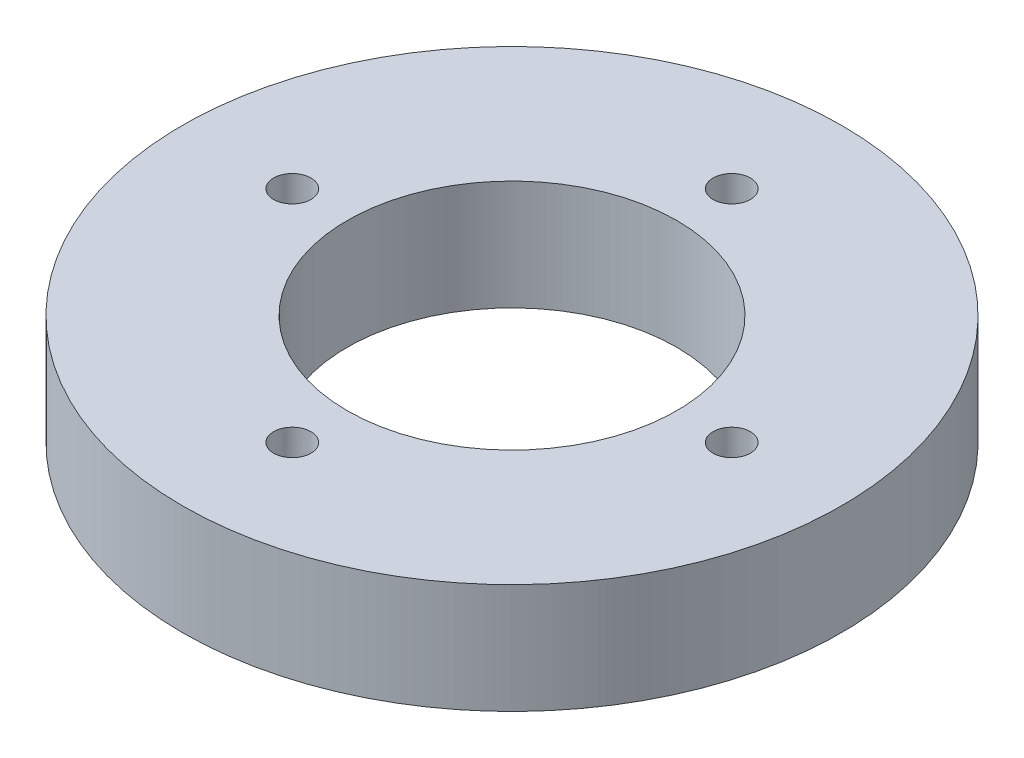
ISO-10303-21;
HEADER;
FILE_DESCRIPTION(('STEP AP214'),'2;1');
FILE_NAME('part.step','',(''),(''),'','','');
FILE_SCHEMA(('AUTOMOTIVE_DESIGN { 1 0 10303 214 1 1 1 1 }'));
ENDSEC;
DATA;
#1=APPLICATION_CONTEXT('core data for automotive mechanical design processes');
#2=APPLICATION_PROTOCOL_DEFINITION('international standard','automotive_design',2000,#1);
#3=PRODUCT_CONTEXT('',#1,'mechanical');
#4=PRODUCT('Part','Part','',(#3));
#5=PRODUCT_RELATED_PRODUCT_CATEGORY('part','',(#4));
#6=PRODUCT_DEFINITION_FORMATION('','',#4);
#7=PRODUCT_DEFINITION_CONTEXT('part definition',#1,'design');
#8=PRODUCT_DEFINITION('design','',#6,#7);
#9=PRODUCT_DEFINITION_SHAPE('','',#8);
#10=(LENGTH_UNIT() NAMED_UNIT(*) SI_UNIT(.MILLI.,.METRE.));
#11=(NAMED_UNIT(*) PLANE_ANGLE_UNIT() SI_UNIT($,.RADIAN.));
#12=(NAMED_UNIT(*) SI_UNIT($,.STERADIAN.) SOLID_ANGLE_UNIT());
#13=UNCERTAINTY_MEASURE_WITH_UNIT(LENGTH_MEASURE(1.E-05),#10,'distance_accuracy_value','');
#14=(GEOMETRIC_REPRESENTATION_CONTEXT(3) GLOBAL_UNCERTAINTY_ASSIGNED_CONTEXT((#13)) GLOBAL_UNIT_ASSIGNED_CONTEXT((#10,
#11,#12)) REPRESENTATION_CONTEXT('',''));
#15=CARTESIAN_POINT('',(0.,0.,0.));
#16=DIRECTION('',(0.,0.,1.));
#17=DIRECTION('',(1.,0.,0.));
#18=AXIS2_PLACEMENT_3D('',#15,#16,#17);
#19=CARTESIAN_POINT('',(20.,0.,2.09488880330588E-13));
#20=DIRECTION('',(0.,1.,0.));
#21=DIRECTION('',(0.,0.,1.));
#22=AXIS2_PLACEMENT_3D('',#19,#20,#21);
#23=CYLINDRICAL_SURFACE('',#22,1.7);
#24=CARTESIAN_POINT('',(20.,10.,2.09488880330588E-13));
#25=DIRECTION('',(0.,1.,0.));
#26=DIRECTION('',(1.,0.,0.));
#27=AXIS2_PLACEMENT_3D('',#24,#25,#26);
#28=CIRCLE('',#27,1.7);
#29=CARTESIAN_POINT('',(21.7,10.,2.27295435158688E-13));
#30=VERTEX_POINT('',#29);
#31=EDGE_CURVE('E422',#30,#30,#28,.T.);
#32=ORIENTED_EDGE('',*,*,#31,.T.);
#33=EDGE_LOOP('',(#32));
#34=FACE_BOUND('',#33,.T.);
#35=CARTESIAN_POINT('',(20.,3.,2.09488880330588E-13));
#36=DIRECTION('',(0.,-1.,0.));
#37=DIRECTION('',(0.,0.,-1.));
#38=AXIS2_PLACEMENT_3D('',#35,#36,#37);
#39=CIRCLE('',#38,1.7);
#40=CARTESIAN_POINT('',(20.,3.,-1.69999999999979));
#41=VERTEX_POINT('',#40);
#42=EDGE_CURVE('E49',#41,#41,#39,.F.);
#43=ORIENTED_EDGE('',*,*,#42,.F.);
#44=EDGE_LOOP('',(#43));
#45=FACE_BOUND('',#44,.T.);
#46=ADVANCED_FACE('F45',(#34,#45),#23,.F.);
#47=CARTESIAN_POINT('',(0.,0.,-20.));
#48=DIRECTION('',(0.,1.,0.));
#49=DIRECTION('',(0.,0.,1.));
#50=AXIS2_PLACEMENT_3D('',#47,#48,#49);
#51=CYLINDRICAL_SURFACE('',#50,1.7);
#52=CARTESIAN_POINT('',(0.,10.,-20.));
#53=DIRECTION('',(0.,1.,0.));
#54=DIRECTION('',(0.,0.,-1.));
#55=AXIS2_PLACEMENT_3D('',#52,#53,#54);
#56=CIRCLE('',#55,1.7);
#57=CARTESIAN_POINT('',(0.,10.,-21.7));
#58=VERTEX_POINT('',#57);
#59=EDGE_CURVE('E418',#58,#58,#56,.T.);
#60=ORIENTED_EDGE('',*,*,#59,.T.);
#61=EDGE_LOOP('',(#60));
#62=FACE_BOUND('',#61,.T.);
#63=CARTESIAN_POINT('',(0.,3.,-20.));
#64=DIRECTION('',(0.,-1.,0.));
#65=DIRECTION('',(0.,0.,-1.));
#66=AXIS2_PLACEMENT_3D('',#63,#64,#65);
#67=CIRCLE('',#66,1.7);
#68=CARTESIAN_POINT('',(0.,3.,-21.7));
#69=VERTEX_POINT('',#68);
#70=EDGE_CURVE('E512',#69,#69,#67,.F.);
#71=ORIENTED_EDGE('',*,*,#70,.F.);
#72=EDGE_LOOP('',(#71));
#73=FACE_BOUND('',#72,.T.);
#74=ADVANCED_FACE('F524',(#62,#73),#51,.F.);
#75=CARTESIAN_POINT('',(-20.,0.,0.));
#76=DIRECTION('',(0.,1.,0.));
#77=DIRECTION('',(0.,0.,1.));
#78=AXIS2_PLACEMENT_3D('',#75,#76,#77);
#79=CYLINDRICAL_SURFACE('',#78,1.7);
#80=CARTESIAN_POINT('',(-20.,10.,0.));
#81=DIRECTION('',(0.,1.,0.));
#82=DIRECTION('',(-1.,0.,0.));
#83=AXIS2_PLACEMENT_3D('',#80,#81,#82);
#84=CIRCLE('',#83,1.7);
#85=CARTESIAN_POINT('',(-21.7,10.,0.));
#86=VERTEX_POINT('',#85);
#87=EDGE_CURVE('E413',#86,#86,#84,.T.);
#88=ORIENTED_EDGE('',*,*,#87,.T.);
#89=EDGE_LOOP('',(#88));
#90=FACE_BOUND('',#89,.T.);
#91=CARTESIAN_POINT('',(-20.,3.,0.));
#92=DIRECTION('',(0.,-1.,0.));
#93=DIRECTION('',(0.,0.,-1.));
#94=AXIS2_PLACEMENT_3D('',#91,#92,#93);
#95=CIRCLE('',#94,1.7);
#96=CARTESIAN_POINT('',(-20.,3.,-1.70000000000007));
#97=VERTEX_POINT('',#96);
#98=EDGE_CURVE('E272',#97,#97,#95,.F.);
#99=ORIENTED_EDGE('',*,*,#98,.F.);
#100=EDGE_LOOP('',(#99));
#101=FACE_BOUND('',#100,.T.);
#102=ADVANCED_FACE('F531',(#90,#101),#79,.F.);
#103=CARTESIAN_POINT('',(0.,0.,20.));
#104=DIRECTION('',(0.,1.,0.));
#105=DIRECTION('',(0.,0.,1.));
#106=AXIS2_PLACEMENT_3D('',#103,#104,#105);
#107=CYLINDRICAL_SURFACE('',#106,1.7);
#108=CARTESIAN_POINT('',(0.,10.,20.));
#109=DIRECTION('',(0.,1.,0.));
#110=DIRECTION('',(0.,0.,1.));
#111=AXIS2_PLACEMENT_3D('',#108,#109,#110);
#112=CIRCLE('',#111,1.7);
#113=CARTESIAN_POINT('',(0.,10.,21.7));
#114=VERTEX_POINT('',#113);
#115=EDGE_CURVE('E492',#114,#114,#112,.T.);
#116=ORIENTED_EDGE('',*,*,#115,.T.);
#117=EDGE_LOOP('',(#116));
#118=FACE_BOUND('',#117,.T.);
#119=CARTESIAN_POINT('',(0.,3.,20.));
#120=DIRECTION('',(0.,-1.,0.));
#121=DIRECTION('',(0.,0.,-1.));
#122=AXIS2_PLACEMENT_3D('',#119,#120,#121);
#123=CIRCLE('',#122,1.7);
#124=CARTESIAN_POINT('',(0.,3.,18.3));
#125=VERTEX_POINT('',#124);
#126=EDGE_CURVE('E476',#125,#125,#123,.F.);
#127=ORIENTED_EDGE('',*,*,#126,.F.);
#128=EDGE_LOOP('',(#127));
#129=FACE_BOUND('',#128,.T.);
#130=ADVANCED_FACE('F564',(#118,#129),#107,.F.);
#131=CARTESIAN_POINT('',(0.,10.,0.));
#132=DIRECTION('',(0.,1.,0.));
#133=DIRECTION('',(0.,0.,1.));
#134=AXIS2_PLACEMENT_3D('',#131,#132,#133);
#135=PLANE('',#134);
#136=ORIENTED_EDGE('',*,*,#87,.F.);
#137=EDGE_LOOP('',(#136));
#138=FACE_BOUND('',#137,.T.);
#139=ORIENTED_EDGE('',*,*,#59,.F.);
#140=EDGE_LOOP('',(#139));
#141=FACE_BOUND('',#140,.T.);
#142=ORIENTED_EDGE('',*,*,#31,.F.);
#143=EDGE_LOOP('',(#142));
#144=FACE_BOUND('',#143,.T.);
#145=ORIENTED_EDGE('',*,*,#115,.F.);
#146=EDGE_LOOP('',(#145));
#147=FACE_BOUND('',#146,.T.);
#148=CARTESIAN_POINT('',(0.,10.,0.));
#149=DIRECTION('',(0.,1.,0.));
#150=DIRECTION('',(0.,0.,1.));
#151=AXIS2_PLACEMENT_3D('',#148,#149,#150);
#152=CIRCLE('',#151,30.);
#153=CARTESIAN_POINT('',(0.,10.,30.));
#154=VERTEX_POINT('',#153);
#155=EDGE_CURVE('E11',#154,#154,#152,.T.);
#156=ORIENTED_EDGE('',*,*,#155,.T.);
#157=EDGE_LOOP('',(#156));
#158=FACE_BOUND('',#157,.T.);
#159=CARTESIAN_POINT('',(0.,10.,0.));
#160=DIRECTION('',(0.,1.,0.));
#161=DIRECTION('',(0.,0.,1.));
#162=AXIS2_PLACEMENT_3D('',#159,#160,#161);
#163=CIRCLE('',#162,15.);
#164=CARTESIAN_POINT('',(0.,10.,15.));
#165=VERTEX_POINT('',#164);
#166=EDGE_CURVE('E497',#165,#165,#163,.T.);
#167=ORIENTED_EDGE('',*,*,#166,.F.);
#168=EDGE_LOOP('',(#167));
#169=FACE_BOUND('',#168,.T.);
#170=ADVANCED_FACE('F567',(#138,#141,#144,#147,#158,#169),#135,.T.);
#171=CARTESIAN_POINT('',(0.,0.,0.));
#172=DIRECTION('',(0.,1.,0.));
#173=DIRECTION('',(0.,0.,1.));
#174=AXIS2_PLACEMENT_3D('',#171,#172,#173);
#175=PLANE('',#174);
#176=DIRECTION('',(-0.866025403784437,0.,-0.500000000000003));
#177=VECTOR('',#176,1.);
#178=CARTESIAN_POINT('',(-20.,0.,3.46410161513768));
#179=LINE('',#178,#177);
#180=CARTESIAN_POINT('',(-20.,0.,3.46410161513769));
#181=VERTEX_POINT('',#180);
#182=CARTESIAN_POINT('',(-23.,0.,1.7320508075688));
#183=VERTEX_POINT('',#182);
#184=EDGE_CURVE('E254',#181,#183,#179,.T.);
#185=ORIENTED_EDGE('',*,*,#184,.F.);
#186=DIRECTION('',(-0.866025403784441,0.,0.499999999999997));
#187=VECTOR('',#186,1.);
#188=CARTESIAN_POINT('',(-17.,0.,1.73205080756882));
#189=LINE('',#188,#187);
#190=CARTESIAN_POINT('',(-17.,0.,1.73205080756882));
#191=VERTEX_POINT('',#190);
#192=EDGE_CURVE('E63',#191,#181,#189,.T.);
#193=ORIENTED_EDGE('',*,*,#192,.F.);
#194=DIRECTION('',(0.,0.,1.));
#195=VECTOR('',#194,1.);
#196=CARTESIAN_POINT('',(-17.,0.,-1.73205080756893));
#197=LINE('',#196,#195);
#198=CARTESIAN_POINT('',(-17.,0.,-1.73205080756893));
#199=VERTEX_POINT('',#198);
#200=EDGE_CURVE('E234',#199,#191,#197,.T.);
#201=ORIENTED_EDGE('',*,*,#200,.F.);
#202=DIRECTION('',(0.866025403784437,0.,0.500000000000003));
#203=VECTOR('',#202,1.);
#204=CARTESIAN_POINT('',(-20.,0.,-3.46410161513782));
#205=LINE('',#204,#203);
#206=CARTESIAN_POINT('',(-20.,0.,-3.46410161513782));
#207=VERTEX_POINT('',#206);
#208=EDGE_CURVE('E238',#207,#199,#205,.T.);
#209=ORIENTED_EDGE('',*,*,#208,.F.);
#210=DIRECTION('',(0.86602540378444,0.,-0.499999999999997));
#211=VECTOR('',#210,1.);
#212=CARTESIAN_POINT('',(-23.,0.,-1.73205080756896));
#213=LINE('',#212,#211);
#214=CARTESIAN_POINT('',(-23.,0.,-1.73205080756896));
#215=VERTEX_POINT('',#214);
#216=EDGE_CURVE('E262',#215,#207,#213,.T.);
#217=ORIENTED_EDGE('',*,*,#216,.F.);
#218=DIRECTION('',(0.,0.,-1.));
#219=VECTOR('',#218,1.);
#220=CARTESIAN_POINT('',(-23.,0.,1.7320508075688));
#221=LINE('',#220,#219);
#222=EDGE_CURVE('E258',#183,#215,#221,.T.);
#223=ORIENTED_EDGE('',*,*,#222,.F.);
#224=EDGE_LOOP('',(#185,#193,#201,#209,#217,#223));
#225=FACE_BOUND('',#224,.T.);
#226=DIRECTION('',(0.5,0.,-0.866025403784439));
#227=VECTOR('',#226,1.);
#228=CARTESIAN_POINT('',(-3.46410161513775,0.,-20.));
#229=LINE('',#228,#227);
#230=CARTESIAN_POINT('',(-3.46410161513775,0.,-20.));
#231=VERTEX_POINT('',#230);
#232=CARTESIAN_POINT('',(-1.73205080756888,0.,-23.));
#233=VERTEX_POINT('',#232);
#234=EDGE_CURVE('E312',#231,#233,#229,.T.);
#235=ORIENTED_EDGE('',*,*,#234,.F.);
#236=DIRECTION('',(-0.5,0.,-0.866025403784439));
#237=VECTOR('',#236,1.);
#238=CARTESIAN_POINT('',(-1.73205080756888,0.,-17.));
#239=LINE('',#238,#237);
#240=CARTESIAN_POINT('',(-1.73205080756888,0.,-17.));
#241=VERTEX_POINT('',#240);
#242=EDGE_CURVE('E71',#241,#231,#239,.T.);
#243=ORIENTED_EDGE('',*,*,#242,.F.);
#244=DIRECTION('',(-1.,0.,0.));
#245=VECTOR('',#244,1.);
#246=CARTESIAN_POINT('',(1.73205080756887,0.,-17.));
#247=LINE('',#246,#245);
#248=CARTESIAN_POINT('',(1.73205080756887,0.,-17.));
#249=VERTEX_POINT('',#248);
#250=EDGE_CURVE('E289',#249,#241,#247,.T.);
#251=ORIENTED_EDGE('',*,*,#250,.F.);
#252=DIRECTION('',(-0.5,0.,0.866025403784439));
#253=VECTOR('',#252,1.);
#254=CARTESIAN_POINT('',(3.46410161513775,0.,-20.));
#255=LINE('',#254,#253);
#256=CARTESIAN_POINT('',(3.46410161513775,0.,-20.));
#257=VERTEX_POINT('',#256);
#258=EDGE_CURVE('E325',#257,#249,#255,.T.);
#259=ORIENTED_EDGE('',*,*,#258,.F.);
#260=DIRECTION('',(0.5,0.,0.866025403784439));
#261=VECTOR('',#260,1.);
#262=CARTESIAN_POINT('',(1.73205080756888,0.,-23.));
#263=LINE('',#262,#261);
#264=CARTESIAN_POINT('',(1.73205080756888,0.,-23.));
#265=VERTEX_POINT('',#264);
#266=EDGE_CURVE('E321',#265,#257,#263,.T.);
#267=ORIENTED_EDGE('',*,*,#266,.F.);
#268=DIRECTION('',(1.,0.,0.));
#269=VECTOR('',#268,1.);
#270=CARTESIAN_POINT('',(-1.73205080756888,0.,-23.));
#271=LINE('',#270,#269);
#272=EDGE_CURVE('E317',#233,#265,#271,.T.);
#273=ORIENTED_EDGE('',*,*,#272,.F.);
#274=EDGE_LOOP('',(#235,#243,#251,#259,#267,#273));
#275=FACE_BOUND('',#274,.T.);
#276=DIRECTION('',(0.866025403784433,0.,0.500000000000009));
#277=VECTOR('',#276,1.);
#278=CARTESIAN_POINT('',(20.,0.,-3.46410161513754));
#279=LINE('',#278,#277);
#280=CARTESIAN_POINT('',(20.,0.,-3.46410161513754));
#281=VERTEX_POINT('',#280);
#282=CARTESIAN_POINT('',(23.,0.,-1.73205080756864));
#283=VERTEX_POINT('',#282);
#284=EDGE_CURVE('E377',#281,#283,#279,.T.);
#285=ORIENTED_EDGE('',*,*,#284,.F.);
#286=DIRECTION('',(0.866025403784444,0.,-0.499999999999991));
#287=VECTOR('',#286,1.);
#288=CARTESIAN_POINT('',(17.,0.,-1.7320508075687));
#289=LINE('',#288,#287);
#290=CARTESIAN_POINT('',(17.,0.,-1.7320508075687));
#291=VERTEX_POINT('',#290);
#292=EDGE_CURVE('E374',#291,#281,#289,.T.);
#293=ORIENTED_EDGE('',*,*,#292,.F.);
#294=DIRECTION('',(0.,0.,-1.));
#295=VECTOR('',#294,1.);
#296=CARTESIAN_POINT('',(17.,0.,1.73205080756905));
#297=LINE('',#296,#295);
#298=CARTESIAN_POINT('',(17.,0.,1.73205080756905));
#299=VERTEX_POINT('',#298);
#300=EDGE_CURVE('E353',#299,#291,#297,.T.);
#301=ORIENTED_EDGE('',*,*,#300,.F.);
#302=DIRECTION('',(-0.866025403784433,0.,-0.500000000000009));
#303=VECTOR('',#302,1.);
#304=CARTESIAN_POINT('',(20.,0.,3.46410161513796));
#305=LINE('',#304,#303);
#306=CARTESIAN_POINT('',(20.,0.,3.46410161513796));
#307=VERTEX_POINT('',#306);
#308=EDGE_CURVE('E389',#307,#299,#305,.T.);
#309=ORIENTED_EDGE('',*,*,#308,.F.);
#310=DIRECTION('',(-0.866025403784444,0.,0.499999999999991));
#311=VECTOR('',#310,1.);
#312=CARTESIAN_POINT('',(23.,0.,1.73205080756912));
#313=LINE('',#312,#311);
#314=CARTESIAN_POINT('',(23.,0.,1.73205080756912));
#315=VERTEX_POINT('',#314);
#316=EDGE_CURVE('E385',#315,#307,#313,.T.);
#317=ORIENTED_EDGE('',*,*,#316,.F.);
#318=DIRECTION('',(0.,0.,1.));
#319=VECTOR('',#318,1.);
#320=CARTESIAN_POINT('',(23.,0.,-1.73205080756864));
#321=LINE('',#320,#319);
#322=EDGE_CURVE('E381',#283,#315,#321,.T.);
#323=ORIENTED_EDGE('',*,*,#322,.F.);
#324=EDGE_LOOP('',(#285,#293,#301,#309,#317,#323));
#325=FACE_BOUND('',#324,.T.);
#326=DIRECTION('',(-0.5,0.,0.866025403784439));
#327=VECTOR('',#326,1.);
#328=CARTESIAN_POINT('',(3.46410161513775,0.,20.));
#329=LINE('',#328,#327);
#330=CARTESIAN_POINT('',(3.46410161513775,0.,20.));
#331=VERTEX_POINT('',#330);
#332=CARTESIAN_POINT('',(1.73205080756888,0.,23.));
#333=VERTEX_POINT('',#332);
#334=EDGE_CURVE('E454',#331,#333,#329,.T.);
#335=ORIENTED_EDGE('',*,*,#334,.F.);
#336=DIRECTION('',(0.5,0.,0.866025403784439));
#337=VECTOR('',#336,1.);
#338=CARTESIAN_POINT('',(1.73205080756888,0.,17.));
#339=LINE('',#338,#337);
#340=CARTESIAN_POINT('',(1.73205080756888,0.,17.));
#341=VERTEX_POINT('',#340);
#342=EDGE_CURVE('E417',#341,#331,#339,.T.);
#343=ORIENTED_EDGE('',*,*,#342,.F.);
#344=DIRECTION('',(1.,0.,0.));
#345=VECTOR('',#344,1.);
#346=CARTESIAN_POINT('',(-1.73205080756887,0.,17.));
#347=LINE('',#346,#345);
#348=CARTESIAN_POINT('',(-1.73205080756887,0.,17.));
#349=VERTEX_POINT('',#348);
#350=EDGE_CURVE('E431',#349,#341,#347,.T.);
#351=ORIENTED_EDGE('',*,*,#350,.F.);
#352=DIRECTION('',(0.5,0.,-0.866025403784439));
#353=VECTOR('',#352,1.);
#354=CARTESIAN_POINT('',(-3.46410161513775,0.,20.));
#355=LINE('',#354,#353);
#356=CARTESIAN_POINT('',(-3.46410161513775,0.,20.));
#357=VERTEX_POINT('',#356);
#358=EDGE_CURVE('E466',#357,#349,#355,.T.);
#359=ORIENTED_EDGE('',*,*,#358,.F.);
#360=DIRECTION('',(-0.5,0.,-0.866025403784439));
#361=VECTOR('',#360,1.);
#362=CARTESIAN_POINT('',(-1.73205080756888,0.,23.));
#363=LINE('',#362,#361);
#364=CARTESIAN_POINT('',(-1.73205080756888,0.,23.));
#365=VERTEX_POINT('',#364);
#366=EDGE_CURVE('E462',#365,#357,#363,.T.);
#367=ORIENTED_EDGE('',*,*,#366,.F.);
#368=DIRECTION('',(-1.,0.,0.));
#369=VECTOR('',#368,1.);
#370=CARTESIAN_POINT('',(1.73205080756888,0.,23.));
#371=LINE('',#370,#369);
#372=EDGE_CURVE('E458',#333,#365,#371,.T.);
#373=ORIENTED_EDGE('',*,*,#372,.F.);
#374=EDGE_LOOP('',(#335,#343,#351,#359,#367,#373));
#375=FACE_BOUND('',#374,.T.);
#376=CARTESIAN_POINT('',(0.,0.,0.));
#377=DIRECTION('',(0.,1.,0.));
#378=DIRECTION('',(0.,0.,1.));
#379=AXIS2_PLACEMENT_3D('',#376,#377,#378);
#380=CIRCLE('',#379,30.);
#381=CARTESIAN_POINT('',(0.,0.,30.));
#382=VERTEX_POINT('',#381);
#383=EDGE_CURVE('E55',#382,#382,#380,.T.);
#384=ORIENTED_EDGE('',*,*,#383,.F.);
#385=EDGE_LOOP('',(#384));
#386=FACE_BOUND('',#385,.T.);
#387=CARTESIAN_POINT('',(0.,0.,0.));
#388=DIRECTION('',(0.,1.,0.));
#389=DIRECTION('',(0.,0.,1.));
#390=AXIS2_PLACEMENT_3D('',#387,#388,#389);
#391=CIRCLE('',#390,15.);
#392=CARTESIAN_POINT('',(0.,0.,15.));
#393=VERTEX_POINT('',#392);
#394=EDGE_CURVE('E496',#393,#393,#391,.T.);
#395=ORIENTED_EDGE('',*,*,#394,.T.);
#396=EDGE_LOOP('',(#395));
#397=FACE_BOUND('',#396,.T.);
#398=ADVANCED_FACE('F573',(#225,#275,#325,#375,#386,#397),#175,.F.);
#399=CARTESIAN_POINT('',(0.,10.,0.));
#400=DIRECTION('',(0.,-1.,0.));
#401=DIRECTION('',(0.,0.,-1.));
#402=AXIS2_PLACEMENT_3D('',#399,#400,#401);
#403=CYLINDRICAL_SURFACE('',#402,30.);
#404=ORIENTED_EDGE('',*,*,#155,.F.);
#405=EDGE_LOOP('',(#404));
#406=FACE_BOUND('',#405,.T.);
#407=ORIENTED_EDGE('',*,*,#383,.T.);
#408=EDGE_LOOP('',(#407));
#409=FACE_BOUND('',#408,.T.);
#410=ADVANCED_FACE('F47',(#406,#409),#403,.T.);
#411=CARTESIAN_POINT('',(0.,10.,0.));
#412=DIRECTION('',(0.,-1.,0.));
#413=DIRECTION('',(0.,0.,-1.));
#414=AXIS2_PLACEMENT_3D('',#411,#412,#413);
#415=CYLINDRICAL_SURFACE('',#414,15.);
#416=ORIENTED_EDGE('',*,*,#166,.T.);
#417=EDGE_LOOP('',(#416));
#418=FACE_BOUND('',#417,.T.);
#419=ORIENTED_EDGE('',*,*,#394,.F.);
#420=EDGE_LOOP('',(#419));
#421=FACE_BOUND('',#420,.T.);
#422=ADVANCED_FACE('F540',(#418,#421),#415,.F.);
#423=CARTESIAN_POINT('',(0.,3.,0.));
#424=DIRECTION('',(0.,-1.,0.));
#425=DIRECTION('',(0.,0.,-1.));
#426=AXIS2_PLACEMENT_3D('',#423,#424,#425);
#427=PLANE('',#426);
#428=DIRECTION('',(0.5,0.,0.866025403784439));
#429=VECTOR('',#428,1.);
#430=CARTESIAN_POINT('',(1.73205080756888,3.,17.));
#431=LINE('',#430,#429);
#432=CARTESIAN_POINT('',(1.73205080756888,3.,17.));
#433=VERTEX_POINT('',#432);
#434=CARTESIAN_POINT('',(3.46410161513775,3.,20.));
#435=VERTEX_POINT('',#434);
#436=EDGE_CURVE('E426',#433,#435,#431,.T.);
#437=ORIENTED_EDGE('',*,*,#436,.T.);
#438=DIRECTION('',(-0.5,0.,0.866025403784439));
#439=VECTOR('',#438,1.);
#440=CARTESIAN_POINT('',(3.46410161513775,3.,20.));
#441=LINE('',#440,#439);
#442=CARTESIAN_POINT('',(1.73205080756888,3.,23.));
#443=VERTEX_POINT('',#442);
#444=EDGE_CURVE('E430',#435,#443,#441,.T.);
#445=ORIENTED_EDGE('',*,*,#444,.T.);
#446=DIRECTION('',(-1.,0.,0.));
#447=VECTOR('',#446,1.);
#448=CARTESIAN_POINT('',(1.73205080756888,3.,23.));
#449=LINE('',#448,#447);
#450=CARTESIAN_POINT('',(-1.73205080756888,3.,23.));
#451=VERTEX_POINT('',#450);
#452=EDGE_CURVE('E435',#443,#451,#449,.T.);
#453=ORIENTED_EDGE('',*,*,#452,.T.);
#454=DIRECTION('',(-0.5,0.,-0.866025403784439));
#455=VECTOR('',#454,1.);
#456=CARTESIAN_POINT('',(-1.73205080756888,3.,23.));
#457=LINE('',#456,#455);
#458=CARTESIAN_POINT('',(-3.46410161513775,3.,20.));
#459=VERTEX_POINT('',#458);
#460=EDGE_CURVE('E439',#451,#459,#457,.T.);
#461=ORIENTED_EDGE('',*,*,#460,.T.);
#462=DIRECTION('',(0.5,0.,-0.866025403784439));
#463=VECTOR('',#462,1.);
#464=CARTESIAN_POINT('',(-3.46410161513775,3.,20.));
#465=LINE('',#464,#463);
#466=CARTESIAN_POINT('',(-1.73205080756887,3.,17.));
#467=VERTEX_POINT('',#466);
#468=EDGE_CURVE('E443',#459,#467,#465,.T.);
#469=ORIENTED_EDGE('',*,*,#468,.T.);
#470=DIRECTION('',(1.,0.,0.));
#471=VECTOR('',#470,1.);
#472=CARTESIAN_POINT('',(-1.73205080756887,3.,17.));
#473=LINE('',#472,#471);
#474=EDGE_CURVE('E447',#467,#433,#473,.T.);
#475=ORIENTED_EDGE('',*,*,#474,.T.);
#476=EDGE_LOOP('',(#437,#445,#453,#461,#469,#475));
#477=FACE_BOUND('',#476,.T.);
#478=ORIENTED_EDGE('',*,*,#126,.T.);
#479=EDGE_LOOP('',(#478));
#480=FACE_BOUND('',#479,.T.);
#481=ADVANCED_FACE('F536',(#477,#480),#427,.T.);
#482=CARTESIAN_POINT('',(1.73205080756888,3.,17.));
#483=DIRECTION('',(0.866025403784439,0.,-0.5));
#484=DIRECTION('',(-0.5,0.,-0.866025403784439));
#485=AXIS2_PLACEMENT_3D('',#482,#483,#484);
#486=PLANE('',#485);
#487=ORIENTED_EDGE('',*,*,#342,.T.);
#488=DIRECTION('',(0.,-1.,0.));
#489=VECTOR('',#488,1.);
#490=CARTESIAN_POINT('',(3.46410161513775,3.,20.));
#491=LINE('',#490,#489);
#492=EDGE_CURVE('E451',#435,#331,#491,.T.);
#493=ORIENTED_EDGE('',*,*,#492,.F.);
#494=ORIENTED_EDGE('',*,*,#436,.F.);
#495=DIRECTION('',(0.,-1.,0.));
#496=VECTOR('',#495,1.);
#497=CARTESIAN_POINT('',(1.73205080756888,3.,17.));
#498=LINE('',#497,#496);
#499=EDGE_CURVE('E473',#433,#341,#498,.T.);
#500=ORIENTED_EDGE('',*,*,#499,.T.);
#501=EDGE_LOOP('',(#487,#493,#494,#500));
#502=FACE_BOUND('',#501,.T.);
#503=ADVANCED_FACE('F539',(#502),#486,.F.);
#504=CARTESIAN_POINT('',(-1.73205080756887,3.,17.));
#505=DIRECTION('',(0.,0.,-1.));
#506=DIRECTION('',(-1.,0.,0.));
#507=AXIS2_PLACEMENT_3D('',#504,#505,#506);
#508=PLANE('',#507);
#509=ORIENTED_EDGE('',*,*,#350,.T.);
#510=ORIENTED_EDGE('',*,*,#499,.F.);
#511=ORIENTED_EDGE('',*,*,#474,.F.);
#512=DIRECTION('',(0.,-1.,0.));
#513=VECTOR('',#512,1.);
#514=CARTESIAN_POINT('',(-1.73205080756887,3.,17.));
#515=LINE('',#514,#513);
#516=EDGE_CURVE('E477',#467,#349,#515,.T.);
#517=ORIENTED_EDGE('',*,*,#516,.T.);
#518=EDGE_LOOP('',(#509,#510,#511,#517));
#519=FACE_BOUND('',#518,.T.);
#520=ADVANCED_FACE('F542',(#519),#508,.F.);
#521=CARTESIAN_POINT('',(-3.46410161513775,3.,20.));
#522=DIRECTION('',(-0.866025403784439,0.,-0.5));
#523=DIRECTION('',(-0.5,0.,0.866025403784439));
#524=AXIS2_PLACEMENT_3D('',#521,#522,#523);
#525=PLANE('',#524);
#526=ORIENTED_EDGE('',*,*,#358,.T.);
#527=ORIENTED_EDGE('',*,*,#516,.F.);
#528=ORIENTED_EDGE('',*,*,#468,.F.);
#529=DIRECTION('',(0.,-1.,0.));
#530=VECTOR('',#529,1.);
#531=CARTESIAN_POINT('',(-3.46410161513775,3.,20.));
#532=LINE('',#531,#530);
#533=EDGE_CURVE('E480',#459,#357,#532,.T.);
#534=ORIENTED_EDGE('',*,*,#533,.T.);
#535=EDGE_LOOP('',(#526,#527,#528,#534));
#536=FACE_BOUND('',#535,.T.);
#537=ADVANCED_FACE('F545',(#536),#525,.F.);
#538=CARTESIAN_POINT('',(-1.73205080756888,3.,23.));
#539=DIRECTION('',(-0.866025403784439,0.,0.5));
#540=DIRECTION('',(0.5,0.,0.866025403784439));
#541=AXIS2_PLACEMENT_3D('',#538,#539,#540);
#542=PLANE('',#541);
#543=ORIENTED_EDGE('',*,*,#366,.T.);
#544=ORIENTED_EDGE('',*,*,#533,.F.);
#545=ORIENTED_EDGE('',*,*,#460,.F.);
#546=DIRECTION('',(0.,-1.,0.));
#547=VECTOR('',#546,1.);
#548=CARTESIAN_POINT('',(-1.73205080756888,3.,23.));
#549=LINE('',#548,#547);
#550=EDGE_CURVE('E483',#451,#365,#549,.T.);
#551=ORIENTED_EDGE('',*,*,#550,.T.);
#552=EDGE_LOOP('',(#543,#544,#545,#551));
#553=FACE_BOUND('',#552,.T.);
#554=ADVANCED_FACE('F549',(#553),#542,.F.);
#555=CARTESIAN_POINT('',(1.73205080756888,3.,23.));
#556=DIRECTION('',(0.,0.,1.));
#557=DIRECTION('',(1.,0.,0.));
#558=AXIS2_PLACEMENT_3D('',#555,#556,#557);
#559=PLANE('',#558);
#560=ORIENTED_EDGE('',*,*,#372,.T.);
#561=ORIENTED_EDGE('',*,*,#550,.F.);
#562=ORIENTED_EDGE('',*,*,#452,.F.);
#563=DIRECTION('',(0.,-1.,0.));
#564=VECTOR('',#563,1.);
#565=CARTESIAN_POINT('',(1.73205080756888,3.,23.));
#566=LINE('',#565,#564);
#567=EDGE_CURVE('E486',#443,#333,#566,.T.);
#568=ORIENTED_EDGE('',*,*,#567,.T.);
#569=EDGE_LOOP('',(#560,#561,#562,#568));
#570=FACE_BOUND('',#569,.T.);
#571=ADVANCED_FACE('F553',(#570),#559,.F.);
#572=CARTESIAN_POINT('',(3.46410161513775,3.,20.));
#573=DIRECTION('',(0.866025403784439,0.,0.5));
#574=DIRECTION('',(0.5,0.,-0.866025403784439));
#575=AXIS2_PLACEMENT_3D('',#572,#573,#574);
#576=PLANE('',#575);
#577=ORIENTED_EDGE('',*,*,#334,.T.);
#578=ORIENTED_EDGE('',*,*,#567,.F.);
#579=ORIENTED_EDGE('',*,*,#444,.F.);
#580=ORIENTED_EDGE('',*,*,#492,.T.);
#581=EDGE_LOOP('',(#577,#578,#579,#580));
#582=FACE_BOUND('',#581,.T.);
#583=ADVANCED_FACE('F557',(#582),#576,.F.);
#584=CARTESIAN_POINT('',(0.,3.,0.));
#585=DIRECTION('',(0.,-1.,0.));
#586=DIRECTION('',(1.,0.,0.));
#587=AXIS2_PLACEMENT_3D('',#584,#585,#586);
#588=PLANE('',#587);
#589=DIRECTION('',(-0.866025403784441,0.,0.499999999999997));
#590=VECTOR('',#589,1.);
#591=CARTESIAN_POINT('',(-17.,3.,1.73205080756882));
#592=LINE('',#591,#590);
#593=CARTESIAN_POINT('',(-17.,3.,1.73205080756882));
#594=VERTEX_POINT('',#593);
#595=CARTESIAN_POINT('',(-20.,3.,3.46410161513768));
#596=VERTEX_POINT('',#595);
#597=EDGE_CURVE('E211',#594,#596,#592,.T.);
#598=ORIENTED_EDGE('',*,*,#597,.T.);
#599=DIRECTION('',(-0.866025403784437,0.,-0.500000000000003));
#600=VECTOR('',#599,1.);
#601=CARTESIAN_POINT('',(-20.,3.,3.46410161513768));
#602=LINE('',#601,#600);
#603=CARTESIAN_POINT('',(-23.,3.,1.7320508075688));
#604=VERTEX_POINT('',#603);
#605=EDGE_CURVE('E221',#596,#604,#602,.T.);
#606=ORIENTED_EDGE('',*,*,#605,.T.);
#607=DIRECTION('',(0.,0.,-1.));
#608=VECTOR('',#607,1.);
#609=CARTESIAN_POINT('',(-23.,3.,1.7320508075688));
#610=LINE('',#609,#608);
#611=CARTESIAN_POINT('',(-23.,3.,-1.73205080756896));
#612=VERTEX_POINT('',#611);
#613=EDGE_CURVE('E227',#604,#612,#610,.T.);
#614=ORIENTED_EDGE('',*,*,#613,.T.);
#615=DIRECTION('',(0.86602540378444,0.,-0.499999999999997));
#616=VECTOR('',#615,1.);
#617=CARTESIAN_POINT('',(-23.,3.,-1.73205080756896));
#618=LINE('',#617,#616);
#619=CARTESIAN_POINT('',(-20.,3.,-3.46410161513782));
#620=VERTEX_POINT('',#619);
#621=EDGE_CURVE('E243',#612,#620,#618,.T.);
#622=ORIENTED_EDGE('',*,*,#621,.T.);
#623=DIRECTION('',(0.866025403784437,0.,0.500000000000003));
#624=VECTOR('',#623,1.);
#625=CARTESIAN_POINT('',(-20.,3.,-3.46410161513782));
#626=LINE('',#625,#624);
#627=CARTESIAN_POINT('',(-17.,3.,-1.73205080756893));
#628=VERTEX_POINT('',#627);
#629=EDGE_CURVE('E247',#620,#628,#626,.T.);
#630=ORIENTED_EDGE('',*,*,#629,.T.);
#631=DIRECTION('',(0.,0.,1.));
#632=VECTOR('',#631,1.);
#633=CARTESIAN_POINT('',(-17.,3.,-1.73205080756893));
#634=LINE('',#633,#632);
#635=EDGE_CURVE('E218',#628,#594,#634,.T.);
#636=ORIENTED_EDGE('',*,*,#635,.T.);
#637=EDGE_LOOP('',(#598,#606,#614,#622,#630,#636));
#638=FACE_BOUND('',#637,.T.);
#639=ORIENTED_EDGE('',*,*,#98,.T.);
#640=EDGE_LOOP('',(#639));
#641=FACE_BOUND('',#640,.T.);
#642=ADVANCED_FACE('F229',(#638,#641),#588,.T.);
#643=CARTESIAN_POINT('',(-17.,3.,1.73205080756882));
#644=DIRECTION('',(0.499999999999997,0.,0.866025403784441));
#645=DIRECTION('',(0.866025403784441,0.,-0.499999999999997));
#646=AXIS2_PLACEMENT_3D('',#643,#644,#645);
#647=PLANE('',#646);
#648=ORIENTED_EDGE('',*,*,#192,.T.);
#649=DIRECTION('',(0.,-1.,0.));
#650=VECTOR('',#649,1.);
#651=CARTESIAN_POINT('',(-20.,3.,3.46410161513768));
#652=LINE('',#651,#650);
#653=EDGE_CURVE('E207',#596,#181,#652,.T.);
#654=ORIENTED_EDGE('',*,*,#653,.F.);
#655=ORIENTED_EDGE('',*,*,#597,.F.);
#656=DIRECTION('',(0.,-1.,0.));
#657=VECTOR('',#656,1.);
#658=CARTESIAN_POINT('',(-17.,3.,1.73205080756882));
#659=LINE('',#658,#657);
#660=EDGE_CURVE('E269',#594,#191,#659,.T.);
#661=ORIENTED_EDGE('',*,*,#660,.T.);
#662=EDGE_LOOP('',(#648,#654,#655,#661));
#663=FACE_BOUND('',#662,.T.);
#664=ADVANCED_FACE('F209',(#663),#647,.F.);
#665=CARTESIAN_POINT('',(-17.,3.,-1.73205080756893));
#666=DIRECTION('',(1.,0.,0.));
#667=DIRECTION('',(0.,0.,-1.));
#668=AXIS2_PLACEMENT_3D('',#665,#666,#667);
#669=PLANE('',#668);
#670=ORIENTED_EDGE('',*,*,#200,.T.);
#671=ORIENTED_EDGE('',*,*,#660,.F.);
#672=ORIENTED_EDGE('',*,*,#635,.F.);
#673=DIRECTION('',(0.,-1.,0.));
#674=VECTOR('',#673,1.);
#675=CARTESIAN_POINT('',(-17.,3.,-1.73205080756893));
#676=LINE('',#675,#674);
#677=EDGE_CURVE('E273',#628,#199,#676,.T.);
#678=ORIENTED_EDGE('',*,*,#677,.T.);
#679=EDGE_LOOP('',(#670,#671,#672,#678));
#680=FACE_BOUND('',#679,.T.);
#681=ADVANCED_FACE('F668',(#680),#669,.F.);
#682=CARTESIAN_POINT('',(-20.,3.,-3.46410161513782));
#683=DIRECTION('',(0.500000000000003,0.,-0.866025403784437));
#684=DIRECTION('',(-0.866025403784437,0.,-0.500000000000003));
#685=AXIS2_PLACEMENT_3D('',#682,#683,#684);
#686=PLANE('',#685);
#687=ORIENTED_EDGE('',*,*,#208,.T.);
#688=ORIENTED_EDGE('',*,*,#677,.F.);
#689=ORIENTED_EDGE('',*,*,#629,.F.);
#690=DIRECTION('',(0.,-1.,0.));
#691=VECTOR('',#690,1.);
#692=CARTESIAN_POINT('',(-20.,3.,-3.46410161513782));
#693=LINE('',#692,#691);
#694=EDGE_CURVE('E276',#620,#207,#693,.T.);
#695=ORIENTED_EDGE('',*,*,#694,.T.);
#696=EDGE_LOOP('',(#687,#688,#689,#695));
#697=FACE_BOUND('',#696,.T.);
#698=ADVANCED_FACE('F673',(#697),#686,.F.);
#699=CARTESIAN_POINT('',(-23.,3.,-1.73205080756896));
#700=DIRECTION('',(-0.499999999999997,0.,-0.86602540378444));
#701=DIRECTION('',(-0.86602540378444,0.,0.499999999999997));
#702=AXIS2_PLACEMENT_3D('',#699,#700,#701);
#703=PLANE('',#702);
#704=ORIENTED_EDGE('',*,*,#216,.T.);
#705=ORIENTED_EDGE('',*,*,#694,.F.);
#706=ORIENTED_EDGE('',*,*,#621,.F.);
#707=DIRECTION('',(0.,-1.,0.));
#708=VECTOR('',#707,1.);
#709=CARTESIAN_POINT('',(-23.,3.,-1.73205080756896));
#710=LINE('',#709,#708);
#711=EDGE_CURVE('E279',#612,#215,#710,.T.);
#712=ORIENTED_EDGE('',*,*,#711,.T.);
#713=EDGE_LOOP('',(#704,#705,#706,#712));
#714=FACE_BOUND('',#713,.T.);
#715=ADVANCED_FACE('F677',(#714),#703,.F.);
#716=CARTESIAN_POINT('',(-23.,3.,1.7320508075688));
#717=DIRECTION('',(-1.,0.,0.));
#718=DIRECTION('',(0.,0.,1.));
#719=AXIS2_PLACEMENT_3D('',#716,#717,#718);
#720=PLANE('',#719);
#721=ORIENTED_EDGE('',*,*,#222,.T.);
#722=ORIENTED_EDGE('',*,*,#711,.F.);
#723=ORIENTED_EDGE('',*,*,#613,.F.);
#724=DIRECTION('',(0.,-1.,0.));
#725=VECTOR('',#724,1.);
#726=CARTESIAN_POINT('',(-23.,3.,1.7320508075688));
#727=LINE('',#726,#725);
#728=EDGE_CURVE('E217',#604,#183,#727,.T.);
#729=ORIENTED_EDGE('',*,*,#728,.T.);
#730=EDGE_LOOP('',(#721,#722,#723,#729));
#731=FACE_BOUND('',#730,.T.);
#732=ADVANCED_FACE('F681',(#731),#720,.F.);
#733=CARTESIAN_POINT('',(-20.,3.,3.46410161513768));
#734=DIRECTION('',(-0.500000000000003,0.,0.866025403784437));
#735=DIRECTION('',(0.866025403784437,0.,0.500000000000003));
#736=AXIS2_PLACEMENT_3D('',#733,#734,#735);
#737=PLANE('',#736);
#738=ORIENTED_EDGE('',*,*,#184,.T.);
#739=ORIENTED_EDGE('',*,*,#728,.F.);
#740=ORIENTED_EDGE('',*,*,#605,.F.);
#741=ORIENTED_EDGE('',*,*,#653,.T.);
#742=EDGE_LOOP('',(#738,#739,#740,#741));
#743=FACE_BOUND('',#742,.T.);
#744=ADVANCED_FACE('F222',(#743),#737,.F.);
#745=CARTESIAN_POINT('',(0.,3.,0.));
#746=DIRECTION('',(0.,-1.,0.));
#747=DIRECTION('',(0.,0.,1.));
#748=AXIS2_PLACEMENT_3D('',#745,#746,#747);
#749=PLANE('',#748);
#750=DIRECTION('',(-0.5,0.,-0.866025403784439));
#751=VECTOR('',#750,1.);
#752=CARTESIAN_POINT('',(-1.73205080756888,3.,-17.));
#753=LINE('',#752,#751);
#754=CARTESIAN_POINT('',(-1.73205080756888,3.,-17.));
#755=VERTEX_POINT('',#754);
#756=CARTESIAN_POINT('',(-3.46410161513775,3.,-20.));
#757=VERTEX_POINT('',#756);
#758=EDGE_CURVE('E284',#755,#757,#753,.T.);
#759=ORIENTED_EDGE('',*,*,#758,.T.);
#760=DIRECTION('',(0.5,0.,-0.866025403784439));
#761=VECTOR('',#760,1.);
#762=CARTESIAN_POINT('',(-3.46410161513775,3.,-20.));
#763=LINE('',#762,#761);
#764=CARTESIAN_POINT('',(-1.73205080756888,3.,-23.));
#765=VERTEX_POINT('',#764);
#766=EDGE_CURVE('E288',#757,#765,#763,.T.);
#767=ORIENTED_EDGE('',*,*,#766,.T.);
#768=DIRECTION('',(1.,0.,0.));
#769=VECTOR('',#768,1.);
#770=CARTESIAN_POINT('',(-1.73205080756888,3.,-23.));
#771=LINE('',#770,#769);
#772=CARTESIAN_POINT('',(1.73205080756888,3.,-23.));
#773=VERTEX_POINT('',#772);
#774=EDGE_CURVE('E293',#765,#773,#771,.T.);
#775=ORIENTED_EDGE('',*,*,#774,.T.);
#776=DIRECTION('',(0.5,0.,0.866025403784439));
#777=VECTOR('',#776,1.);
#778=CARTESIAN_POINT('',(1.73205080756888,3.,-23.));
#779=LINE('',#778,#777);
#780=CARTESIAN_POINT('',(3.46410161513775,3.,-20.));
#781=VERTEX_POINT('',#780);
#782=EDGE_CURVE('E297',#773,#781,#779,.T.);
#783=ORIENTED_EDGE('',*,*,#782,.T.);
#784=DIRECTION('',(-0.5,0.,0.866025403784439));
#785=VECTOR('',#784,1.);
#786=CARTESIAN_POINT('',(3.46410161513775,3.,-20.));
#787=LINE('',#786,#785);
#788=CARTESIAN_POINT('',(1.73205080756887,3.,-17.));
#789=VERTEX_POINT('',#788);
#790=EDGE_CURVE('E301',#781,#789,#787,.T.);
#791=ORIENTED_EDGE('',*,*,#790,.T.);
#792=DIRECTION('',(-1.,0.,0.));
#793=VECTOR('',#792,1.);
#794=CARTESIAN_POINT('',(1.73205080756887,3.,-17.));
#795=LINE('',#794,#793);
#796=EDGE_CURVE('E305',#789,#755,#795,.T.);
#797=ORIENTED_EDGE('',*,*,#796,.T.);
#798=EDGE_LOOP('',(#759,#767,#775,#783,#791,#797));
#799=FACE_BOUND('',#798,.T.);
#800=ORIENTED_EDGE('',*,*,#70,.T.);
#801=EDGE_LOOP('',(#800));
#802=FACE_BOUND('',#801,.T.);
#803=ADVANCED_FACE('F687',(#799,#802),#749,.T.);
#804=CARTESIAN_POINT('',(-1.73205080756888,3.,-17.));
#805=DIRECTION('',(-0.866025403784439,0.,0.5));
#806=DIRECTION('',(0.5,0.,0.866025403784439));
#807=AXIS2_PLACEMENT_3D('',#804,#805,#806);
#808=PLANE('',#807);
#809=ORIENTED_EDGE('',*,*,#242,.T.);
#810=DIRECTION('',(0.,-1.,0.));
#811=VECTOR('',#810,1.);
#812=CARTESIAN_POINT('',(-3.46410161513775,3.,-20.));
#813=LINE('',#812,#811);
#814=EDGE_CURVE('E309',#757,#231,#813,.T.);
#815=ORIENTED_EDGE('',*,*,#814,.F.);
#816=ORIENTED_EDGE('',*,*,#758,.F.);
#817=DIRECTION('',(0.,-1.,0.));
#818=VECTOR('',#817,1.);
#819=CARTESIAN_POINT('',(-1.73205080756888,3.,-17.));
#820=LINE('',#819,#818);
#821=EDGE_CURVE('E255',#755,#241,#820,.T.);
#822=ORIENTED_EDGE('',*,*,#821,.T.);
#823=EDGE_LOOP('',(#809,#815,#816,#822));
#824=FACE_BOUND('',#823,.T.);
#825=ADVANCED_FACE('F647',(#824),#808,.F.);
#826=CARTESIAN_POINT('',(1.73205080756887,3.,-17.));
#827=DIRECTION('',(0.,0.,1.));
#828=DIRECTION('',(1.,0.,0.));
#829=AXIS2_PLACEMENT_3D('',#826,#827,#828);
#830=PLANE('',#829);
#831=ORIENTED_EDGE('',*,*,#250,.T.);
#832=ORIENTED_EDGE('',*,*,#821,.F.);
#833=ORIENTED_EDGE('',*,*,#796,.F.);
#834=DIRECTION('',(0.,-1.,0.));
#835=VECTOR('',#834,1.);
#836=CARTESIAN_POINT('',(1.73205080756887,3.,-17.));
#837=LINE('',#836,#835);
#838=EDGE_CURVE('E334',#789,#249,#837,.T.);
#839=ORIENTED_EDGE('',*,*,#838,.T.);
#840=EDGE_LOOP('',(#831,#832,#833,#839));
#841=FACE_BOUND('',#840,.T.);
#842=ADVANCED_FACE('F692',(#841),#830,.F.);
#843=CARTESIAN_POINT('',(3.46410161513775,3.,-20.));
#844=DIRECTION('',(0.866025403784439,0.,0.5));
#845=DIRECTION('',(0.5,0.,-0.866025403784439));
#846=AXIS2_PLACEMENT_3D('',#843,#844,#845);
#847=PLANE('',#846);
#848=ORIENTED_EDGE('',*,*,#258,.T.);
#849=ORIENTED_EDGE('',*,*,#838,.F.);
#850=ORIENTED_EDGE('',*,*,#790,.F.);
#851=DIRECTION('',(0.,-1.,0.));
#852=VECTOR('',#851,1.);
#853=CARTESIAN_POINT('',(3.46410161513775,3.,-20.));
#854=LINE('',#853,#852);
#855=EDGE_CURVE('E337',#781,#257,#854,.T.);
#856=ORIENTED_EDGE('',*,*,#855,.T.);
#857=EDGE_LOOP('',(#848,#849,#850,#856));
#858=FACE_BOUND('',#857,.T.);
#859=ADVANCED_FACE('F695',(#858),#847,.F.);
#860=CARTESIAN_POINT('',(1.73205080756888,3.,-23.));
#861=DIRECTION('',(0.866025403784439,0.,-0.5));
#862=DIRECTION('',(-0.5,0.,-0.866025403784439));
#863=AXIS2_PLACEMENT_3D('',#860,#861,#862);
#864=PLANE('',#863);
#865=ORIENTED_EDGE('',*,*,#266,.T.);
#866=ORIENTED_EDGE('',*,*,#855,.F.);
#867=ORIENTED_EDGE('',*,*,#782,.F.);
#868=DIRECTION('',(0.,-1.,0.));
#869=VECTOR('',#868,1.);
#870=CARTESIAN_POINT('',(1.73205080756888,3.,-23.));
#871=LINE('',#870,#869);
#872=EDGE_CURVE('E340',#773,#265,#871,.T.);
#873=ORIENTED_EDGE('',*,*,#872,.T.);
#874=EDGE_LOOP('',(#865,#866,#867,#873));
#875=FACE_BOUND('',#874,.T.);
#876=ADVANCED_FACE('F699',(#875),#864,.F.);
#877=CARTESIAN_POINT('',(-1.73205080756888,3.,-23.));
#878=DIRECTION('',(0.,0.,-1.));
#879=DIRECTION('',(-1.,0.,0.));
#880=AXIS2_PLACEMENT_3D('',#877,#878,#879);
#881=PLANE('',#880);
#882=ORIENTED_EDGE('',*,*,#272,.T.);
#883=ORIENTED_EDGE('',*,*,#872,.F.);
#884=ORIENTED_EDGE('',*,*,#774,.F.);
#885=DIRECTION('',(0.,-1.,0.));
#886=VECTOR('',#885,1.);
#887=CARTESIAN_POINT('',(-1.73205080756888,3.,-23.));
#888=LINE('',#887,#886);
#889=EDGE_CURVE('E343',#765,#233,#888,.T.);
#890=ORIENTED_EDGE('',*,*,#889,.T.);
#891=EDGE_LOOP('',(#882,#883,#884,#890));
#892=FACE_BOUND('',#891,.T.);
#893=ADVANCED_FACE('F642',(#892),#881,.F.);
#894=CARTESIAN_POINT('',(-3.46410161513775,3.,-20.));
#895=DIRECTION('',(-0.866025403784439,0.,-0.5));
#896=DIRECTION('',(-0.5,0.,0.866025403784439));
#897=AXIS2_PLACEMENT_3D('',#894,#895,#896);
#898=PLANE('',#897);
#899=ORIENTED_EDGE('',*,*,#234,.T.);
#900=ORIENTED_EDGE('',*,*,#889,.F.);
#901=ORIENTED_EDGE('',*,*,#766,.F.);
#902=ORIENTED_EDGE('',*,*,#814,.T.);
#903=EDGE_LOOP('',(#899,#900,#901,#902));
#904=FACE_BOUND('',#903,.T.);
#905=ADVANCED_FACE('F635',(#904),#898,.F.);
#906=CARTESIAN_POINT('',(0.,3.,0.));
#907=DIRECTION('',(0.,-1.,0.));
#908=DIRECTION('',(-1.,0.,0.));
#909=AXIS2_PLACEMENT_3D('',#906,#907,#908);
#910=PLANE('',#909);
#911=DIRECTION('',(0.866025403784444,0.,-0.499999999999991));
#912=VECTOR('',#911,1.);
#913=CARTESIAN_POINT('',(17.,3.,-1.7320508075687));
#914=LINE('',#913,#912);
#915=CARTESIAN_POINT('',(17.,3.,-1.7320508075687));
#916=VERTEX_POINT('',#915);
#917=CARTESIAN_POINT('',(20.,3.,-3.46410161513754));
#918=VERTEX_POINT('',#917);
#919=EDGE_CURVE('E348',#916,#918,#914,.T.);
#920=ORIENTED_EDGE('',*,*,#919,.T.);
#921=DIRECTION('',(0.866025403784433,0.,0.500000000000009));
#922=VECTOR('',#921,1.);
#923=CARTESIAN_POINT('',(20.,3.,-3.46410161513754));
#924=LINE('',#923,#922);
#925=CARTESIAN_POINT('',(23.,3.,-1.73205080756864));
#926=VERTEX_POINT('',#925);
#927=EDGE_CURVE('E352',#918,#926,#924,.T.);
#928=ORIENTED_EDGE('',*,*,#927,.T.);
#929=DIRECTION('',(0.,0.,1.));
#930=VECTOR('',#929,1.);
#931=CARTESIAN_POINT('',(23.,3.,-1.73205080756864));
#932=LINE('',#931,#930);
#933=CARTESIAN_POINT('',(23.,3.,1.73205080756912));
#934=VERTEX_POINT('',#933);
#935=EDGE_CURVE('E357',#926,#934,#932,.T.);
#936=ORIENTED_EDGE('',*,*,#935,.T.);
#937=DIRECTION('',(-0.866025403784444,0.,0.499999999999991));
#938=VECTOR('',#937,1.);
#939=CARTESIAN_POINT('',(23.,3.,1.73205080756912));
#940=LINE('',#939,#938);
#941=CARTESIAN_POINT('',(20.,3.,3.46410161513796));
#942=VERTEX_POINT('',#941);
#943=EDGE_CURVE('E361',#934,#942,#940,.T.);
#944=ORIENTED_EDGE('',*,*,#943,.T.);
#945=DIRECTION('',(-0.866025403784433,0.,-0.500000000000009));
#946=VECTOR('',#945,1.);
#947=CARTESIAN_POINT('',(20.,3.,3.46410161513796));
#948=LINE('',#947,#946);
#949=CARTESIAN_POINT('',(17.,3.,1.73205080756905));
#950=VERTEX_POINT('',#949);
#951=EDGE_CURVE('E365',#942,#950,#948,.T.);
#952=ORIENTED_EDGE('',*,*,#951,.T.);
#953=DIRECTION('',(0.,0.,-1.));
#954=VECTOR('',#953,1.);
#955=CARTESIAN_POINT('',(17.,3.,1.73205080756905));
#956=LINE('',#955,#954);
#957=EDGE_CURVE('E369',#950,#916,#956,.T.);
#958=ORIENTED_EDGE('',*,*,#957,.T.);
#959=EDGE_LOOP('',(#920,#928,#936,#944,#952,#958));
#960=FACE_BOUND('',#959,.T.);
#961=ORIENTED_EDGE('',*,*,#42,.T.);
#962=EDGE_LOOP('',(#961));
#963=FACE_BOUND('',#962,.T.);
#964=ADVANCED_FACE('F521',(#960,#963),#910,.T.);
#965=CARTESIAN_POINT('',(17.,3.,-1.7320508075687));
#966=DIRECTION('',(-0.49999999999999,0.,-0.866025403784444));
#967=DIRECTION('',(-0.866025403784444,0.,0.499999999999991));
#968=AXIS2_PLACEMENT_3D('',#965,#966,#967);
#969=PLANE('',#968);
#970=ORIENTED_EDGE('',*,*,#292,.T.);
#971=DIRECTION('',(0.,-1.,0.));
#972=VECTOR('',#971,1.);
#973=CARTESIAN_POINT('',(20.,3.,-3.46410161513754));
#974=LINE('',#973,#972);
#975=EDGE_CURVE('E373',#918,#281,#974,.T.);
#976=ORIENTED_EDGE('',*,*,#975,.F.);
#977=ORIENTED_EDGE('',*,*,#919,.F.);
#978=DIRECTION('',(0.,-1.,0.));
#979=VECTOR('',#978,1.);
#980=CARTESIAN_POINT('',(17.,3.,-1.7320508075687));
#981=LINE('',#980,#979);
#982=EDGE_CURVE('E313',#916,#291,#981,.T.);
#983=ORIENTED_EDGE('',*,*,#982,.T.);
#984=EDGE_LOOP('',(#970,#976,#977,#983));
#985=FACE_BOUND('',#984,.T.);
#986=ADVANCED_FACE('F620',(#985),#969,.F.);
#987=CARTESIAN_POINT('',(17.,3.,1.73205080756905));
#988=DIRECTION('',(-1.,0.,0.));
#989=DIRECTION('',(0.,0.,1.));
#990=AXIS2_PLACEMENT_3D('',#987,#988,#989);
#991=PLANE('',#990);
#992=ORIENTED_EDGE('',*,*,#300,.T.);
#993=ORIENTED_EDGE('',*,*,#982,.F.);
#994=ORIENTED_EDGE('',*,*,#957,.F.);
#995=DIRECTION('',(0.,-1.,0.));
#996=VECTOR('',#995,1.);
#997=CARTESIAN_POINT('',(17.,3.,1.73205080756905));
#998=LINE('',#997,#996);
#999=EDGE_CURVE('E398',#950,#299,#998,.T.);
#1000=ORIENTED_EDGE('',*,*,#999,.T.);
#1001=EDGE_LOOP('',(#992,#993,#994,#1000));
#1002=FACE_BOUND('',#1001,.T.);
#1003=ADVANCED_FACE('F623',(#1002),#991,.F.);
#1004=CARTESIAN_POINT('',(20.,3.,3.46410161513796));
#1005=DIRECTION('',(-0.500000000000009,0.,0.866025403784433));
#1006=DIRECTION('',(0.866025403784433,0.,0.500000000000009));
#1007=AXIS2_PLACEMENT_3D('',#1004,#1005,#1006);
#1008=PLANE('',#1007);
#1009=ORIENTED_EDGE('',*,*,#308,.T.);
#1010=ORIENTED_EDGE('',*,*,#999,.F.);
#1011=ORIENTED_EDGE('',*,*,#951,.F.);
#1012=DIRECTION('',(0.,-1.,0.));
#1013=VECTOR('',#1012,1.);
#1014=CARTESIAN_POINT('',(20.,3.,3.46410161513796));
#1015=LINE('',#1014,#1013);
#1016=EDGE_CURVE('E401',#942,#307,#1015,.T.);
#1017=ORIENTED_EDGE('',*,*,#1016,.T.);
#1018=EDGE_LOOP('',(#1009,#1010,#1011,#1017));
#1019=FACE_BOUND('',#1018,.T.);
#1020=ADVANCED_FACE('F626',(#1019),#1008,.F.);
#1021=CARTESIAN_POINT('',(23.,3.,1.73205080756912));
#1022=DIRECTION('',(0.499999999999991,0.,0.866025403784444));
#1023=DIRECTION('',(0.866025403784444,0.,-0.499999999999991));
#1024=AXIS2_PLACEMENT_3D('',#1021,#1022,#1023);
#1025=PLANE('',#1024);
#1026=ORIENTED_EDGE('',*,*,#316,.T.);
#1027=ORIENTED_EDGE('',*,*,#1016,.F.);
#1028=ORIENTED_EDGE('',*,*,#943,.F.);
#1029=DIRECTION('',(0.,-1.,0.));
#1030=VECTOR('',#1029,1.);
#1031=CARTESIAN_POINT('',(23.,3.,1.73205080756912));
#1032=LINE('',#1031,#1030);
#1033=EDGE_CURVE('E404',#934,#315,#1032,.T.);
#1034=ORIENTED_EDGE('',*,*,#1033,.T.);
#1035=EDGE_LOOP('',(#1026,#1027,#1028,#1034));
#1036=FACE_BOUND('',#1035,.T.);
#1037=ADVANCED_FACE('F630',(#1036),#1025,.F.);
#1038=CARTESIAN_POINT('',(23.,3.,-1.73205080756864));
#1039=DIRECTION('',(1.,0.,0.));
#1040=DIRECTION('',(0.,0.,-1.));
#1041=AXIS2_PLACEMENT_3D('',#1038,#1039,#1040);
#1042=PLANE('',#1041);
#1043=ORIENTED_EDGE('',*,*,#322,.T.);
#1044=ORIENTED_EDGE('',*,*,#1033,.F.);
#1045=ORIENTED_EDGE('',*,*,#935,.F.);
#1046=DIRECTION('',(0.,-1.,0.));
#1047=VECTOR('',#1046,1.);
#1048=CARTESIAN_POINT('',(23.,3.,-1.73205080756864));
#1049=LINE('',#1048,#1047);
#1050=EDGE_CURVE('E407',#926,#283,#1049,.T.);
#1051=ORIENTED_EDGE('',*,*,#1050,.T.);
#1052=EDGE_LOOP('',(#1043,#1044,#1045,#1051));
#1053=FACE_BOUND('',#1052,.T.);
#1054=ADVANCED_FACE('F632',(#1053),#1042,.F.);
#1055=CARTESIAN_POINT('',(20.,3.,-3.46410161513754));
#1056=DIRECTION('',(0.500000000000009,0.,-0.866025403784433));
#1057=DIRECTION('',(-0.866025403784434,0.,-0.500000000000009));
#1058=AXIS2_PLACEMENT_3D('',#1055,#1056,#1057);
#1059=PLANE('',#1058);
#1060=ORIENTED_EDGE('',*,*,#284,.T.);
#1061=ORIENTED_EDGE('',*,*,#1050,.F.);
#1062=ORIENTED_EDGE('',*,*,#927,.F.);
#1063=ORIENTED_EDGE('',*,*,#975,.T.);
#1064=EDGE_LOOP('',(#1060,#1061,#1062,#1063));
#1065=FACE_BOUND('',#1064,.T.);
#1066=ADVANCED_FACE('F615',(#1065),#1059,.F.);
#1067=CLOSED_SHELL('',(#46,#74,#102,#130,#170,#398,#410,#422,#481,#503,#520,#537,#554,#571,#583,
#642,#664,#681,#698,#715,#732,#744,#803,#825,#842,#859,#876,#893,#905,#964,#986,#1003,#1020,
#1037,#1054,#1066));
#1068=MANIFOLD_SOLID_BREP('B2',#1067);
#1069=ADVANCED_BREP_SHAPE_REPRESENTATION('',(#18,#1068),#14);
#1070=SHAPE_DEFINITION_REPRESENTATION(#9,#1069);
ENDSEC;
END-ISO-10303-21;
